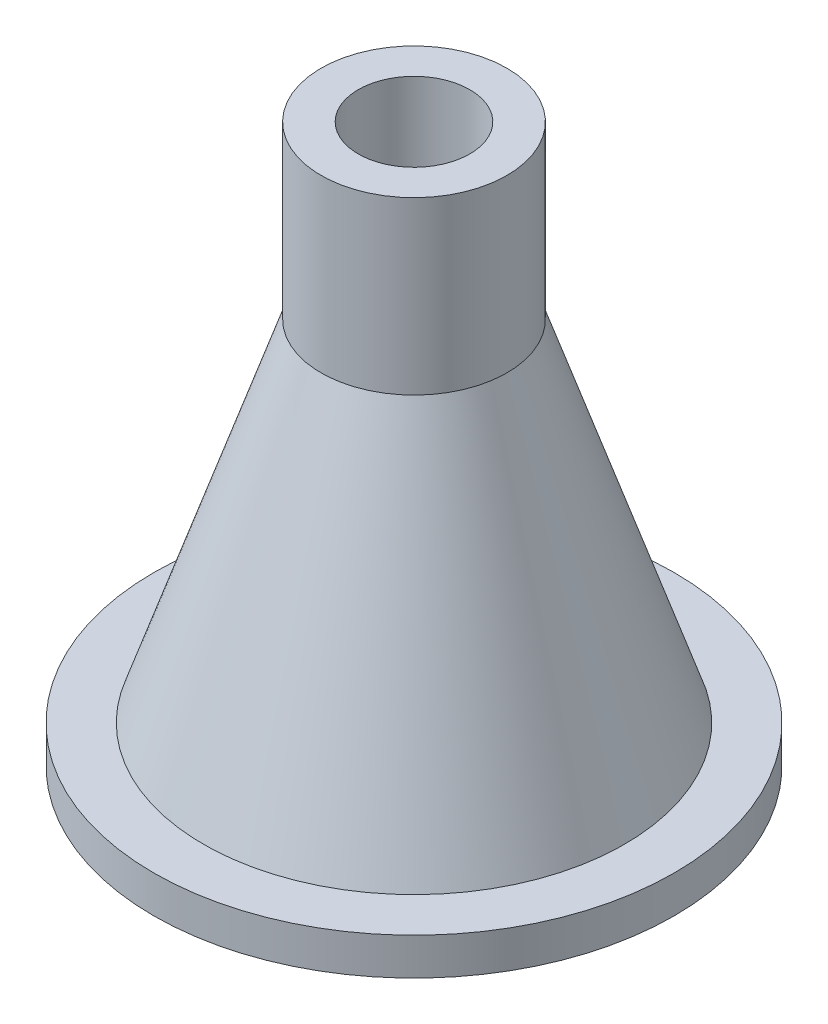
ISO-10303-21;
HEADER;
FILE_DESCRIPTION(('STEP AP214'),'2;1');
FILE_NAME('part.step','',(''),(''),'','','');
FILE_SCHEMA(('AUTOMOTIVE_DESIGN { 1 0 10303 214 1 1 1 1 }'));
ENDSEC;
DATA;
#1=APPLICATION_CONTEXT('core data for automotive mechanical design processes');
#2=APPLICATION_PROTOCOL_DEFINITION('international standard','automotive_design',2000,#1);
#3=PRODUCT_CONTEXT('',#1,'mechanical');
#4=PRODUCT('Part','Part','',(#3));
#5=PRODUCT_RELATED_PRODUCT_CATEGORY('part','',(#4));
#6=PRODUCT_DEFINITION_FORMATION('','',#4);
#7=PRODUCT_DEFINITION_CONTEXT('part definition',#1,'design');
#8=PRODUCT_DEFINITION('design','',#6,#7);
#9=PRODUCT_DEFINITION_SHAPE('','',#8);
#10=(LENGTH_UNIT() NAMED_UNIT(*) SI_UNIT(.MILLI.,.METRE.));
#11=(NAMED_UNIT(*) PLANE_ANGLE_UNIT() SI_UNIT($,.RADIAN.));
#12=(NAMED_UNIT(*) SI_UNIT($,.STERADIAN.) SOLID_ANGLE_UNIT());
#13=UNCERTAINTY_MEASURE_WITH_UNIT(LENGTH_MEASURE(1.E-05),#10,'distance_accuracy_value','');
#14=(GEOMETRIC_REPRESENTATION_CONTEXT(3) GLOBAL_UNCERTAINTY_ASSIGNED_CONTEXT((#13)) GLOBAL_UNIT_ASSIGNED_CONTEXT((#10,
#11,#12)) REPRESENTATION_CONTEXT('',''));
#15=CARTESIAN_POINT('',(0.,0.,0.));
#16=DIRECTION('',(0.,0.,1.));
#17=DIRECTION('',(1.,0.,0.));
#18=AXIS2_PLACEMENT_3D('',#15,#16,#17);
#19=CARTESIAN_POINT('',(75.,750.,0.));
#20=DIRECTION('',(0.,1.,0.));
#21=DIRECTION('',(0.,0.,1.));
#22=AXIS2_PLACEMENT_3D('',#19,#20,#21);
#23=PLANE('',#22);
#24=CARTESIAN_POINT('',(0.,750.,0.));
#25=DIRECTION('',(0.,-1.,0.));
#26=DIRECTION('',(0.,0.,-1.));
#27=AXIS2_PLACEMENT_3D('',#24,#25,#26);
#28=CIRCLE('',#27,75.);
#29=CARTESIAN_POINT('',(0.,750.,-75.));
#30=VERTEX_POINT('',#29);
#31=EDGE_CURVE('E76',#30,#30,#28,.T.);
#32=ORIENTED_EDGE('',*,*,#31,.T.);
#33=EDGE_LOOP('',(#32));
#34=FACE_BOUND('',#33,.T.);
#35=CARTESIAN_POINT('',(0.,750.,0.));
#36=DIRECTION('',(0.,-1.,0.));
#37=DIRECTION('',(0.,0.,-1.));
#38=AXIS2_PLACEMENT_3D('',#35,#36,#37);
#39=CIRCLE('',#38,125.);
#40=CARTESIAN_POINT('',(0.,750.,-125.));
#41=VERTEX_POINT('',#40);
#42=EDGE_CURVE('E10',#41,#41,#39,.T.);
#43=ORIENTED_EDGE('',*,*,#42,.F.);
#44=EDGE_LOOP('',(#43));
#45=FACE_BOUND('',#44,.T.);
#46=ADVANCED_FACE('F41',(#34,#45),#23,.T.);
#47=CARTESIAN_POINT('',(0.,0.,0.));
#48=DIRECTION('',(0.,-1.,0.));
#49=DIRECTION('',(0.,0.,-1.));
#50=AXIS2_PLACEMENT_3D('',#47,#48,#49);
#51=CYLINDRICAL_SURFACE('',#50,125.);
#52=ORIENTED_EDGE('',*,*,#42,.T.);
#53=EDGE_LOOP('',(#52));
#54=FACE_BOUND('',#53,.T.);
#55=CARTESIAN_POINT('',(0.,520.,0.));
#56=DIRECTION('',(0.,-1.,0.));
#57=DIRECTION('',(0.,0.,-1.));
#58=AXIS2_PLACEMENT_3D('',#55,#56,#57);
#59=CIRCLE('',#58,125.);
#60=CARTESIAN_POINT('',(0.,520.,-125.));
#61=VERTEX_POINT('',#60);
#62=EDGE_CURVE('E48',#61,#61,#59,.T.);
#63=ORIENTED_EDGE('',*,*,#62,.F.);
#64=EDGE_LOOP('',(#63));
#65=FACE_BOUND('',#64,.T.);
#66=ADVANCED_FACE('F95',(#54,#65),#51,.T.);
#67=CARTESIAN_POINT('',(0.,50.,0.));
#68=DIRECTION('',(0.,-1.,0.));
#69=DIRECTION('',(0.,0.,-1.));
#70=AXIS2_PLACEMENT_3D('',#67,#68,#69);
#71=CONICAL_SURFACE('',#70,283.173076923077,0.324632390799154);
#72=ORIENTED_EDGE('',*,*,#62,.T.);
#73=EDGE_LOOP('',(#72));
#74=FACE_BOUND('',#73,.T.);
#75=CARTESIAN_POINT('',(0.,50.,0.));
#76=DIRECTION('',(0.,-1.,0.));
#77=DIRECTION('',(0.,0.,-1.));
#78=AXIS2_PLACEMENT_3D('',#75,#76,#77);
#79=CIRCLE('',#78,283.173076923077);
#80=CARTESIAN_POINT('',(0.,50.,-283.173076923077));
#81=VERTEX_POINT('',#80);
#82=EDGE_CURVE('E53',#81,#81,#79,.T.);
#83=ORIENTED_EDGE('',*,*,#82,.F.);
#84=EDGE_LOOP('',(#83));
#85=FACE_BOUND('',#84,.T.);
#86=ADVANCED_FACE('F99',(#74,#85),#71,.T.);
#87=CARTESIAN_POINT('',(283.173076923077,50.,0.));
#88=DIRECTION('',(0.,1.,0.));
#89=DIRECTION('',(0.,0.,1.));
#90=AXIS2_PLACEMENT_3D('',#87,#88,#89);
#91=PLANE('',#90);
#92=ORIENTED_EDGE('',*,*,#82,.T.);
#93=EDGE_LOOP('',(#92));
#94=FACE_BOUND('',#93,.T.);
#95=CARTESIAN_POINT('',(0.,50.,0.));
#96=DIRECTION('',(0.,-1.,0.));
#97=DIRECTION('',(0.,0.,-1.));
#98=AXIS2_PLACEMENT_3D('',#95,#96,#97);
#99=CIRCLE('',#98,350.);
#100=CARTESIAN_POINT('',(0.,50.,-350.));
#101=VERTEX_POINT('',#100);
#102=EDGE_CURVE('E58',#101,#101,#99,.T.);
#103=ORIENTED_EDGE('',*,*,#102,.F.);
#104=EDGE_LOOP('',(#103));
#105=FACE_BOUND('',#104,.T.);
#106=ADVANCED_FACE('F103',(#94,#105),#91,.T.);
#107=CARTESIAN_POINT('',(0.,0.,0.));
#108=DIRECTION('',(0.,-1.,0.));
#109=DIRECTION('',(0.,0.,-1.));
#110=AXIS2_PLACEMENT_3D('',#107,#108,#109);
#111=CYLINDRICAL_SURFACE('',#110,350.);
#112=ORIENTED_EDGE('',*,*,#102,.T.);
#113=EDGE_LOOP('',(#112));
#114=FACE_BOUND('',#113,.T.);
#115=CARTESIAN_POINT('',(0.,0.,0.));
#116=DIRECTION('',(0.,-1.,0.));
#117=DIRECTION('',(0.,0.,-1.));
#118=AXIS2_PLACEMENT_3D('',#115,#116,#117);
#119=CIRCLE('',#118,350.);
#120=CARTESIAN_POINT('',(0.,0.,-350.));
#121=VERTEX_POINT('',#120);
#122=EDGE_CURVE('E64',#121,#121,#119,.T.);
#123=ORIENTED_EDGE('',*,*,#122,.F.);
#124=EDGE_LOOP('',(#123));
#125=FACE_BOUND('',#124,.T.);
#126=ADVANCED_FACE('F109',(#114,#125),#111,.T.);
#127=CARTESIAN_POINT('',(350.,0.,0.));
#128=DIRECTION('',(0.,-1.,0.));
#129=DIRECTION('',(0.,0.,-1.));
#130=AXIS2_PLACEMENT_3D('',#127,#128,#129);
#131=PLANE('',#130);
#132=ORIENTED_EDGE('',*,*,#122,.T.);
#133=EDGE_LOOP('',(#132));
#134=FACE_BOUND('',#133,.T.);
#135=CARTESIAN_POINT('',(0.,0.,0.));
#136=DIRECTION('',(0.,-1.,0.));
#137=DIRECTION('',(0.,0.,-1.));
#138=AXIS2_PLACEMENT_3D('',#135,#136,#137);
#139=CIRCLE('',#138,250.);
#140=CARTESIAN_POINT('',(0.,0.,-250.));
#141=VERTEX_POINT('',#140);
#142=EDGE_CURVE('E68',#141,#141,#139,.T.);
#143=ORIENTED_EDGE('',*,*,#142,.F.);
#144=EDGE_LOOP('',(#143));
#145=FACE_BOUND('',#144,.T.);
#146=ADVANCED_FACE('F91',(#134,#145),#131,.T.);
#147=CARTESIAN_POINT('',(0.,520.,0.));
#148=DIRECTION('',(0.,-1.,0.));
#149=DIRECTION('',(0.,0.,-1.));
#150=AXIS2_PLACEMENT_3D('',#147,#148,#149);
#151=CONICAL_SURFACE('',#150,74.9999999999999,0.324632390799154);
#152=CARTESIAN_POINT('',(0.,520.,0.));
#153=DIRECTION('',(0.,-1.,0.));
#154=DIRECTION('',(0.,0.,-1.));
#155=AXIS2_PLACEMENT_3D('',#152,#153,#154);
#156=CIRCLE('',#155,74.9999999999999);
#157=CARTESIAN_POINT('',(0.,520.,-74.9999999999999));
#158=VERTEX_POINT('',#157);
#159=EDGE_CURVE('E72',#158,#158,#156,.T.);
#160=CARTESIAN_POINT('',(0.,0.,-250.));
#161=CARTESIAN_POINT('',(0.,5.41666666666666,-248.177083333333));
#162=CARTESIAN_POINT('',(0.,10.8333333333333,-246.354166666667));
#163=CARTESIAN_POINT('',(0.,21.6666666666667,-242.708333333333));
#164=CARTESIAN_POINT('',(0.,27.0833333333333,-240.885416666667));
#165=CARTESIAN_POINT('',(0.,37.9166666666667,-237.239583333333));
#166=CARTESIAN_POINT('',(0.,43.3333333333334,-235.416666666667));
#167=CARTESIAN_POINT('',(0.,54.1666666666667,-231.770833333333));
#168=CARTESIAN_POINT('',(0.,59.5833333333333,-229.947916666667));
#169=CARTESIAN_POINT('',(0.,70.4166666666667,-226.302083333333));
#170=CARTESIAN_POINT('',(0.,75.8333333333334,-224.479166666667));
#171=CARTESIAN_POINT('',(0.,86.6666666666667,-220.833333333333));
#172=CARTESIAN_POINT('',(0.,92.0833333333334,-219.010416666667));
#173=CARTESIAN_POINT('',(0.,102.916666666667,-215.364583333333));
#174=CARTESIAN_POINT('',(0.,108.333333333333,-213.541666666667));
#175=CARTESIAN_POINT('',(0.,119.166666666667,-209.895833333333));
#176=CARTESIAN_POINT('',(0.,124.583333333333,-208.072916666667));
#177=CARTESIAN_POINT('',(0.,135.416666666667,-204.427083333333));
#178=CARTESIAN_POINT('',(0.,140.833333333333,-202.604166666667));
#179=CARTESIAN_POINT('',(0.,151.666666666667,-198.958333333333));
#180=CARTESIAN_POINT('',(0.,157.083333333333,-197.135416666667));
#181=CARTESIAN_POINT('',(0.,167.916666666667,-193.489583333333));
#182=CARTESIAN_POINT('',(0.,173.333333333333,-191.666666666667));
#183=CARTESIAN_POINT('',(0.,184.166666666667,-188.020833333333));
#184=CARTESIAN_POINT('',(0.,189.583333333333,-186.197916666667));
#185=CARTESIAN_POINT('',(0.,200.416666666667,-182.552083333333));
#186=CARTESIAN_POINT('',(0.,205.833333333333,-180.729166666667));
#187=CARTESIAN_POINT('',(0.,216.666666666667,-177.083333333333));
#188=CARTESIAN_POINT('',(0.,222.083333333333,-175.260416666667));
#189=CARTESIAN_POINT('',(0.,232.916666666667,-171.614583333333));
#190=CARTESIAN_POINT('',(0.,238.333333333333,-169.791666666667));
#191=CARTESIAN_POINT('',(0.,249.166666666667,-166.145833333333));
#192=CARTESIAN_POINT('',(0.,254.583333333333,-164.322916666667));
#193=CARTESIAN_POINT('',(0.,265.416666666667,-160.677083333333));
#194=CARTESIAN_POINT('',(0.,270.833333333333,-158.854166666667));
#195=CARTESIAN_POINT('',(0.,281.666666666667,-155.208333333333));
#196=CARTESIAN_POINT('',(0.,287.083333333333,-153.385416666667));
#197=CARTESIAN_POINT('',(0.,297.916666666667,-149.739583333333));
#198=CARTESIAN_POINT('',(0.,303.333333333333,-147.916666666667));
#199=CARTESIAN_POINT('',(0.,314.166666666667,-144.270833333333));
#200=CARTESIAN_POINT('',(0.,319.583333333333,-142.447916666667));
#201=CARTESIAN_POINT('',(0.,330.416666666667,-138.802083333333));
#202=CARTESIAN_POINT('',(0.,335.833333333333,-136.979166666667));
#203=CARTESIAN_POINT('',(0.,346.666666666667,-133.333333333333));
#204=CARTESIAN_POINT('',(0.,352.083333333333,-131.510416666667));
#205=CARTESIAN_POINT('',(0.,362.916666666667,-127.864583333333));
#206=CARTESIAN_POINT('',(0.,368.333333333333,-126.041666666667));
#207=CARTESIAN_POINT('',(0.,379.166666666667,-122.395833333333));
#208=CARTESIAN_POINT('',(0.,384.583333333333,-120.572916666667));
#209=CARTESIAN_POINT('',(0.,395.416666666667,-116.927083333333));
#210=CARTESIAN_POINT('',(0.,400.833333333333,-115.104166666667));
#211=CARTESIAN_POINT('',(0.,411.666666666667,-111.458333333333));
#212=CARTESIAN_POINT('',(0.,417.083333333333,-109.635416666667));
#213=CARTESIAN_POINT('',(0.,427.916666666667,-105.989583333333));
#214=CARTESIAN_POINT('',(0.,433.333333333333,-104.166666666667));
#215=CARTESIAN_POINT('',(0.,444.166666666667,-100.520833333333));
#216=CARTESIAN_POINT('',(0.,449.583333333333,-98.6979166666666));
#217=CARTESIAN_POINT('',(0.,460.416666666667,-95.0520833333332));
#218=CARTESIAN_POINT('',(0.,465.833333333333,-93.2291666666666));
#219=CARTESIAN_POINT('',(0.,476.666666666667,-89.5833333333332));
#220=CARTESIAN_POINT('',(0.,482.083333333333,-87.7604166666666));
#221=CARTESIAN_POINT('',(0.,492.916666666667,-84.1145833333332));
#222=CARTESIAN_POINT('',(0.,498.333333333333,-82.2916666666666));
#223=CARTESIAN_POINT('',(0.,509.166666666667,-78.6458333333332));
#224=CARTESIAN_POINT('',(0.,514.583333333333,-76.8229166666666));
#225=CARTESIAN_POINT('',(0.,520.,-74.9999999999999));
#226=B_SPLINE_CURVE_WITH_KNOTS('',3,(#160,#161,#162,#163,#164,#165,#166,#167,#168,#169,#170,
#171,#172,#173,#174,#175,#176,#177,#178,#179,#180,#181,#182,#183,#184,#185,#186,#187,#188,#189,
#190,#191,#192,#193,#194,#195,#196,#197,#198,#199,#200,#201,#202,#203,#204,#205,#206,#207,#208,
#209,#210,#211,#212,#213,#214,#215,#216,#217,#218,#219,#220,#221,#222,#223,#224,#225),
.UNSPECIFIED.,.F.,.F.,(4,2,2,2,2,2,2,2,2,2,2,2,2,2,2,2,2,2,2,2,2,2,2,2,2,2,2,2,2,2,2,2,4),(0.,
17.1455453853909,34.2910907707819,51.4366361561728,68.5821815415637,85.7277269269547,
102.873272312346,120.018817697736,137.164363083127,154.309908468518,171.455453853909,
188.6009992393,205.746544624691,222.892090010082,240.037635395473,257.183180780864,
274.328726166255,291.474271551646,308.619816937037,325.765362322428,342.910907707819,
360.05645309321,377.201998478601,394.347543863991,411.493089249382,428.638634634773,
445.784180020164,462.929725405555,480.075270790946,497.220816176337,514.366361561728,
531.511906947119,548.65745233251),.UNSPECIFIED.);
#227=EDGE_CURVE('BSEAM85',#141,#158,#226,.T.);
#228=ORIENTED_EDGE('',*,*,#142,.T.);
#229=ORIENTED_EDGE('',*,*,#159,.F.);
#230=ORIENTED_EDGE('',*,*,#227,.T.);
#231=ORIENTED_EDGE('',*,*,#227,.F.);
#232=EDGE_LOOP('',(#228,#230,#229,#231));
#233=FACE_BOUND('',#232,.T.);
#234=ADVANCED_FACE('F85',(#233),#151,.F.);
#235=CARTESIAN_POINT('',(0.,0.,0.));
#236=DIRECTION('',(0.,-1.,0.));
#237=DIRECTION('',(0.,0.,-1.));
#238=AXIS2_PLACEMENT_3D('',#235,#236,#237);
#239=CYLINDRICAL_SURFACE('',#238,75.);
#240=ORIENTED_EDGE('',*,*,#159,.T.);
#241=EDGE_LOOP('',(#240));
#242=FACE_BOUND('',#241,.T.);
#243=ORIENTED_EDGE('',*,*,#31,.F.);
#244=EDGE_LOOP('',(#243));
#245=FACE_BOUND('',#244,.T.);
#246=ADVANCED_FACE('F83',(#242,#245),#239,.F.);
#247=CLOSED_SHELL('',(#46,#66,#86,#106,#126,#146,#234,#246));
#248=MANIFOLD_SOLID_BREP('B2',#247);
#249=ADVANCED_BREP_SHAPE_REPRESENTATION('',(#18,#248),#14);
#250=SHAPE_DEFINITION_REPRESENTATION(#9,#249);
ENDSEC;
END-ISO-10303-21;
